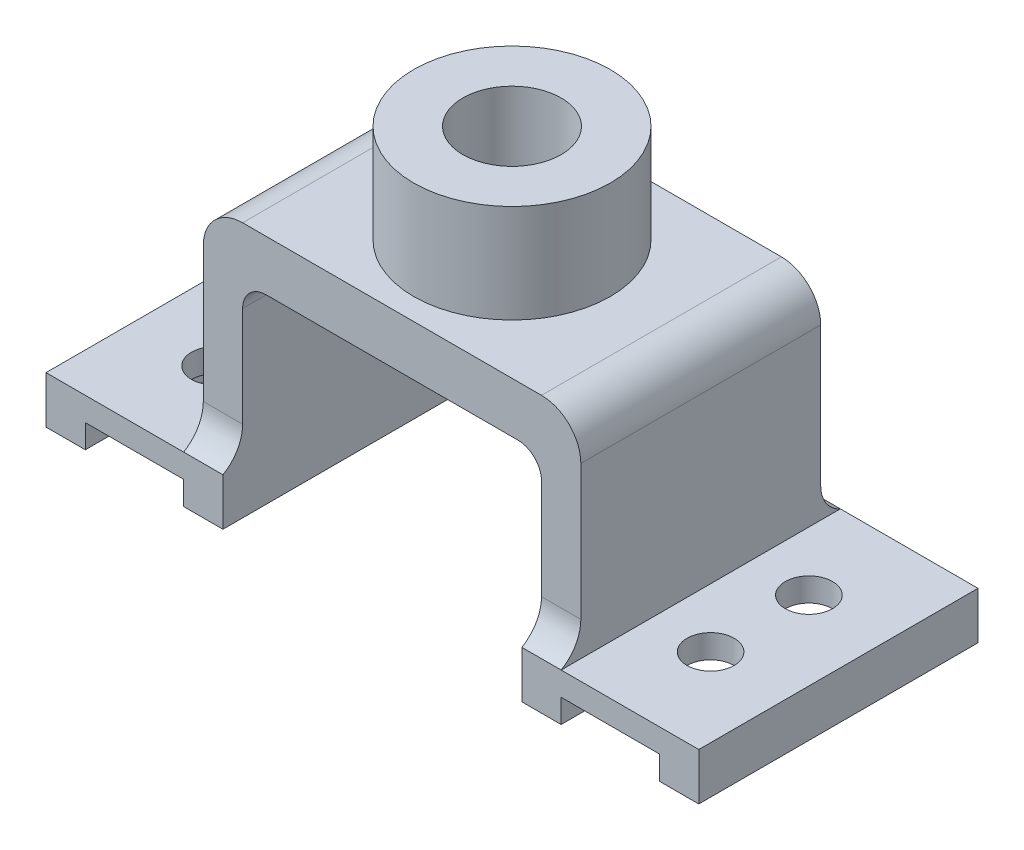
ISO-10303-21;
HEADER;
FILE_DESCRIPTION(('STEP AP214'),'2;1');
FILE_NAME('part.step','',(''),(''),'','','');
FILE_SCHEMA(('AUTOMOTIVE_DESIGN { 1 0 10303 214 1 1 1 1 }'));
ENDSEC;
DATA;
#1=APPLICATION_CONTEXT('core data for automotive mechanical design processes');
#2=APPLICATION_PROTOCOL_DEFINITION('international standard','automotive_design',2000,#1);
#3=PRODUCT_CONTEXT('',#1,'mechanical');
#4=PRODUCT('Part','Part','',(#3));
#5=PRODUCT_RELATED_PRODUCT_CATEGORY('part','',(#4));
#6=PRODUCT_DEFINITION_FORMATION('','',#4);
#7=PRODUCT_DEFINITION_CONTEXT('part definition',#1,'design');
#8=PRODUCT_DEFINITION('design','',#6,#7);
#9=PRODUCT_DEFINITION_SHAPE('','',#8);
#10=(LENGTH_UNIT() NAMED_UNIT(*) SI_UNIT(.MILLI.,.METRE.));
#11=(NAMED_UNIT(*) PLANE_ANGLE_UNIT() SI_UNIT($,.RADIAN.));
#12=(NAMED_UNIT(*) SI_UNIT($,.STERADIAN.) SOLID_ANGLE_UNIT());
#13=UNCERTAINTY_MEASURE_WITH_UNIT(LENGTH_MEASURE(1.E-05),#10,'distance_accuracy_value','');
#14=(GEOMETRIC_REPRESENTATION_CONTEXT(3) GLOBAL_UNCERTAINTY_ASSIGNED_CONTEXT((#13)) GLOBAL_UNIT_ASSIGNED_CONTEXT((#10,
#11,#12)) REPRESENTATION_CONTEXT('',''));
#15=CARTESIAN_POINT('',(0.,0.,0.));
#16=DIRECTION('',(0.,0.,1.));
#17=DIRECTION('',(1.,0.,0.));
#18=AXIS2_PLACEMENT_3D('',#15,#16,#17);
#19=CARTESIAN_POINT('',(0.,65.,0.));
#20=DIRECTION('',(0.,1.,0.));
#21=DIRECTION('',(0.,0.,1.));
#22=AXIS2_PLACEMENT_3D('',#19,#20,#21);
#23=PLANE('',#22);
#24=DIRECTION('',(-1.,0.,0.));
#25=VECTOR('',#24,1.);
#26=CARTESIAN_POINT('',(166.000025,65.,-5.));
#27=LINE('',#26,#25);
#28=CARTESIAN_POINT('',(121.,65.,-5.));
#29=VERTEX_POINT('',#28);
#30=CARTESIAN_POINT('',(45.,65.,-5.));
#31=VERTEX_POINT('',#30);
#32=EDGE_CURVE('E445',#29,#31,#27,.T.);
#33=ORIENTED_EDGE('',*,*,#32,.F.);
#34=DIRECTION('',(0.,0.,-1.));
#35=VECTOR('',#34,1.);
#36=CARTESIAN_POINT('',(121.,65.,0.));
#37=LINE('',#36,#35);
#38=CARTESIAN_POINT('',(121.,65.,-66.));
#39=VERTEX_POINT('',#38);
#40=EDGE_CURVE('E676',#29,#39,#37,.T.);
#41=ORIENTED_EDGE('',*,*,#40,.T.);
#42=DIRECTION('',(-1.,0.,0.));
#43=VECTOR('',#42,1.);
#44=CARTESIAN_POINT('',(166.000025,65.,-66.));
#45=LINE('',#44,#43);
#46=CARTESIAN_POINT('',(45.,65.,-66.));
#47=VERTEX_POINT('',#46);
#48=EDGE_CURVE('E464',#39,#47,#45,.T.);
#49=ORIENTED_EDGE('',*,*,#48,.T.);
#50=DIRECTION('',(0.,0.,1.));
#51=VECTOR('',#50,1.);
#52=CARTESIAN_POINT('',(45.,65.,0.));
#53=LINE('',#52,#51);
#54=EDGE_CURVE('E342',#47,#31,#53,.T.);
#55=ORIENTED_EDGE('',*,*,#54,.T.);
#56=EDGE_LOOP('',(#33,#41,#49,#55));
#57=FACE_BOUND('',#56,.T.);
#58=CARTESIAN_POINT('',(83.,65.,-35.5));
#59=DIRECTION('',(0.,1.,0.));
#60=DIRECTION('',(0.,0.,1.));
#61=AXIS2_PLACEMENT_3D('',#58,#59,#60);
#62=CIRCLE('',#61,25.);
#63=CARTESIAN_POINT('',(83.,65.,-10.5));
#64=VERTEX_POINT('',#63);
#65=EDGE_CURVE('E1028',#64,#64,#62,.T.);
#66=ORIENTED_EDGE('',*,*,#65,.F.);
#67=EDGE_LOOP('',(#66));
#68=FACE_BOUND('',#67,.T.);
#69=ADVANCED_FACE('F33',(#57,#68),#23,.T.);
#70=CARTESIAN_POINT('',(121.,55.,0.));
#71=DIRECTION('',(0.,0.,1.));
#72=DIRECTION('',(1.,0.,0.));
#73=AXIS2_PLACEMENT_3D('',#70,#71,#72);
#74=CYLINDRICAL_SURFACE('',#73,10.);
#75=ORIENTED_EDGE('',*,*,#40,.F.);
#76=CARTESIAN_POINT('',(121.,55.,-5.));
#77=DIRECTION('',(0.,0.,-1.));
#78=DIRECTION('',(0.,1.,0.));
#79=AXIS2_PLACEMENT_3D('',#76,#77,#78);
#80=CIRCLE('',#79,10.);
#81=CARTESIAN_POINT('',(131.,55.,-5.));
#82=VERTEX_POINT('',#81);
#83=EDGE_CURVE('E42',#82,#29,#80,.F.);
#84=ORIENTED_EDGE('',*,*,#83,.F.);
#85=DIRECTION('',(0.,0.,-1.));
#86=VECTOR('',#85,1.);
#87=CARTESIAN_POINT('',(131.,55.,0.));
#88=LINE('',#87,#86);
#89=CARTESIAN_POINT('',(131.,55.,-66.));
#90=VERTEX_POINT('',#89);
#91=EDGE_CURVE('E686',#90,#82,#88,.F.);
#92=ORIENTED_EDGE('',*,*,#91,.F.);
#93=CARTESIAN_POINT('',(121.,55.,-66.));
#94=DIRECTION('',(0.,0.,1.));
#95=DIRECTION('',(1.,0.,0.));
#96=AXIS2_PLACEMENT_3D('',#93,#94,#95);
#97=CIRCLE('',#96,10.);
#98=EDGE_CURVE('E11',#39,#90,#97,.F.);
#99=ORIENTED_EDGE('',*,*,#98,.F.);
#100=EDGE_LOOP('',(#75,#84,#92,#99));
#101=FACE_BOUND('',#100,.T.);
#102=ADVANCED_FACE('F35',(#101),#74,.T.);
#103=CARTESIAN_POINT('',(45.,55.,0.));
#104=DIRECTION('',(0.,0.,-1.));
#105=DIRECTION('',(-1.,0.,0.));
#106=AXIS2_PLACEMENT_3D('',#103,#104,#105);
#107=CYLINDRICAL_SURFACE('',#106,10.);
#108=ORIENTED_EDGE('',*,*,#54,.F.);
#109=CARTESIAN_POINT('',(45.,55.,-66.));
#110=DIRECTION('',(0.,0.,1.));
#111=DIRECTION('',(1.,0.,0.));
#112=AXIS2_PLACEMENT_3D('',#109,#110,#111);
#113=CIRCLE('',#112,10.);
#114=CARTESIAN_POINT('',(35.,55.,-66.));
#115=VERTEX_POINT('',#114);
#116=EDGE_CURVE('E677',#115,#47,#113,.F.);
#117=ORIENTED_EDGE('',*,*,#116,.F.);
#118=DIRECTION('',(0.,0.,1.));
#119=VECTOR('',#118,1.);
#120=CARTESIAN_POINT('',(35.,55.,0.));
#121=LINE('',#120,#119);
#122=CARTESIAN_POINT('',(35.,55.,-5.));
#123=VERTEX_POINT('',#122);
#124=EDGE_CURVE('E679',#123,#115,#121,.F.);
#125=ORIENTED_EDGE('',*,*,#124,.F.);
#126=CARTESIAN_POINT('',(45.,55.,-5.));
#127=DIRECTION('',(0.,0.,-1.));
#128=DIRECTION('',(0.,1.,0.));
#129=AXIS2_PLACEMENT_3D('',#126,#127,#128);
#130=CIRCLE('',#129,10.);
#131=EDGE_CURVE('E671',#31,#123,#130,.F.);
#132=ORIENTED_EDGE('',*,*,#131,.F.);
#133=EDGE_LOOP('',(#108,#117,#125,#132));
#134=FACE_BOUND('',#133,.T.);
#135=ADVANCED_FACE('F397',(#134),#107,.T.);
#136=CARTESIAN_POINT('',(0.,12.,0.));
#137=DIRECTION('',(0.,-1.,0.));
#138=DIRECTION('',(0.,0.,-1.));
#139=AXIS2_PLACEMENT_3D('',#136,#137,#138);
#140=PLANE('',#139);
#141=CARTESIAN_POINT('',(146.,12.,-23.));
#142=DIRECTION('',(0.,1.,0.));
#143=DIRECTION('',(0.,0.,1.));
#144=AXIS2_PLACEMENT_3D('',#141,#142,#143);
#145=CIRCLE('',#144,6.00000000000002);
#146=CARTESIAN_POINT('',(146.,12.,-17.));
#147=VERTEX_POINT('',#146);
#148=EDGE_CURVE('E344',#147,#147,#145,.T.);
#149=ORIENTED_EDGE('',*,*,#148,.F.);
#150=EDGE_LOOP('',(#149));
#151=FACE_BOUND('',#150,.T.);
#152=CARTESIAN_POINT('',(146.,12.,-48.));
#153=DIRECTION('',(0.,1.,0.));
#154=DIRECTION('',(0.,0.,1.));
#155=AXIS2_PLACEMENT_3D('',#152,#153,#154);
#156=CIRCLE('',#155,6.00000000000002);
#157=CARTESIAN_POINT('',(146.,12.,-42.));
#158=VERTEX_POINT('',#157);
#159=EDGE_CURVE('E386',#158,#158,#156,.T.);
#160=ORIENTED_EDGE('',*,*,#159,.F.);
#161=EDGE_LOOP('',(#160));
#162=FACE_BOUND('',#161,.T.);
#163=DIRECTION('',(-1.,0.,0.));
#164=VECTOR('',#163,1.);
#165=CARTESIAN_POINT('',(0.,12.,-71.));
#166=LINE('',#165,#164);
#167=CARTESIAN_POINT('',(166.,12.,-71.));
#168=VERTEX_POINT('',#167);
#169=CARTESIAN_POINT('',(131.,12.,-71.));
#170=VERTEX_POINT('',#169);
#171=EDGE_CURVE('E363',#168,#170,#166,.T.);
#172=ORIENTED_EDGE('',*,*,#171,.T.);
#173=DIRECTION('',(0.,0.,-1.));
#174=VECTOR('',#173,1.);
#175=CARTESIAN_POINT('',(131.,12.,-71.));
#176=LINE('',#175,#174);
#177=CARTESIAN_POINT('',(131.,12.,0.));
#178=VERTEX_POINT('',#177);
#179=EDGE_CURVE('E244',#178,#170,#176,.T.);
#180=ORIENTED_EDGE('',*,*,#179,.F.);
#181=DIRECTION('',(1.,0.,0.));
#182=VECTOR('',#181,1.);
#183=CARTESIAN_POINT('',(0.,12.,0.));
#184=LINE('',#183,#182);
#185=CARTESIAN_POINT('',(166.,12.,0.));
#186=VERTEX_POINT('',#185);
#187=EDGE_CURVE('E350',#178,#186,#184,.T.);
#188=ORIENTED_EDGE('',*,*,#187,.T.);
#189=DIRECTION('',(0.,0.,-1.));
#190=VECTOR('',#189,1.);
#191=CARTESIAN_POINT('',(166.,12.,0.));
#192=LINE('',#191,#190);
#193=EDGE_CURVE('E349',#186,#168,#192,.T.);
#194=ORIENTED_EDGE('',*,*,#193,.T.);
#195=EDGE_LOOP('',(#172,#180,#188,#194));
#196=FACE_BOUND('',#195,.T.);
#197=ADVANCED_FACE('F393',(#151,#162,#196),#140,.F.);
#198=CARTESIAN_POINT('',(166.000025,65.,-5.));
#199=DIRECTION('',(0.,0.,-1.));
#200=DIRECTION('',(0.,1.,0.));
#201=AXIS2_PLACEMENT_3D('',#198,#199,#200);
#202=PLANE('',#201);
#203=DIRECTION('',(0.,-1.,0.));
#204=VECTOR('',#203,1.);
#205=CARTESIAN_POINT('',(131.,65.,-5.));
#206=LINE('',#205,#204);
#207=CARTESIAN_POINT('',(131.,20.6602540378444,-5.));
#208=VERTEX_POINT('',#207);
#209=EDGE_CURVE('E459',#82,#208,#206,.T.);
#210=ORIENTED_EDGE('',*,*,#209,.F.);
#211=ORIENTED_EDGE('',*,*,#83,.T.);
#212=ORIENTED_EDGE('',*,*,#32,.T.);
#213=ORIENTED_EDGE('',*,*,#131,.T.);
#214=DIRECTION('',(0.,-1.,0.));
#215=VECTOR('',#214,1.);
#216=CARTESIAN_POINT('',(35.,65.,-5.));
#217=LINE('',#216,#215);
#218=CARTESIAN_POINT('',(35.,20.6602540378444,-5.));
#219=VERTEX_POINT('',#218);
#220=EDGE_CURVE('E438',#123,#219,#217,.T.);
#221=ORIENTED_EDGE('',*,*,#220,.T.);
#222=DIRECTION('',(-1.,0.,0.));
#223=VECTOR('',#222,1.);
#224=CARTESIAN_POINT('',(55.,20.6602540378444,-5.));
#225=LINE('',#224,#223);
#226=CARTESIAN_POINT('',(45.,20.6602540378444,-5.));
#227=VERTEX_POINT('',#226);
#228=EDGE_CURVE('E430',#227,#219,#225,.T.);
#229=ORIENTED_EDGE('',*,*,#228,.F.);
#230=DIRECTION('',(0.,-1.,0.));
#231=VECTOR('',#230,1.);
#232=CARTESIAN_POINT('',(45.,0.,-4.99999999999999));
#233=LINE('',#232,#231);
#234=CARTESIAN_POINT('',(45.,46.1355405561037,-5.));
#235=VERTEX_POINT('',#234);
#236=EDGE_CURVE('E456',#235,#227,#233,.T.);
#237=ORIENTED_EDGE('',*,*,#236,.F.);
#238=CARTESIAN_POINT('',(51.,46.1355405561037,-5.));
#239=DIRECTION('',(0.,0.,-1.));
#240=DIRECTION('',(0.,1.,0.));
#241=AXIS2_PLACEMENT_3D('',#238,#239,#240);
#242=CIRCLE('',#241,6.);
#243=CARTESIAN_POINT('',(51.0000000000001,52.1355405561037,-5.));
#244=VERTEX_POINT('',#243);
#245=EDGE_CURVE('E453',#244,#235,#242,.F.);
#246=ORIENTED_EDGE('',*,*,#245,.F.);
#247=DIRECTION('',(-1.,0.,0.));
#248=VECTOR('',#247,1.);
#249=CARTESIAN_POINT('',(51.0000000000001,52.1355405561037,-5.));
#250=LINE('',#249,#248);
#251=CARTESIAN_POINT('',(115.,52.1355405561037,-5.00000000000001));
#252=VERTEX_POINT('',#251);
#253=EDGE_CURVE('E450',#252,#244,#250,.T.);
#254=ORIENTED_EDGE('',*,*,#253,.F.);
#255=CARTESIAN_POINT('',(115.,46.1355405561037,-5.));
#256=DIRECTION('',(0.,0.,-1.));
#257=DIRECTION('',(0.,1.,0.));
#258=AXIS2_PLACEMENT_3D('',#255,#256,#257);
#259=CIRCLE('',#258,6.);
#260=CARTESIAN_POINT('',(121.,46.1355405561037,-5.));
#261=VERTEX_POINT('',#260);
#262=EDGE_CURVE('E447',#261,#252,#259,.F.);
#263=ORIENTED_EDGE('',*,*,#262,.F.);
#264=DIRECTION('',(0.,1.,0.));
#265=VECTOR('',#264,1.);
#266=CARTESIAN_POINT('',(121.,0.,-4.99999999999999));
#267=LINE('',#266,#265);
#268=CARTESIAN_POINT('',(121.,20.6602540378444,-4.99999999999999));
#269=VERTEX_POINT('',#268);
#270=EDGE_CURVE('E340',#269,#261,#267,.T.);
#271=ORIENTED_EDGE('',*,*,#270,.F.);
#272=DIRECTION('',(1.,0.,0.));
#273=VECTOR('',#272,1.);
#274=CARTESIAN_POINT('',(111.,20.6602540378444,-5.));
#275=LINE('',#274,#273);
#276=EDGE_CURVE('E420',#269,#208,#275,.T.);
#277=ORIENTED_EDGE('',*,*,#276,.T.);
#278=EDGE_LOOP('',(#210,#211,#212,#213,#221,#229,#237,#246,#254,#263,#271,#277));
#279=FACE_BOUND('',#278,.T.);
#280=ADVANCED_FACE('F396',(#279),#202,.F.);
#281=CARTESIAN_POINT('',(20.,12.,-23.));
#282=DIRECTION('',(0.,1.,0.));
#283=DIRECTION('',(0.,0.,1.));
#284=AXIS2_PLACEMENT_3D('',#281,#282,#283);
#285=CIRCLE('',#284,5.99999999999999);
#286=CARTESIAN_POINT('',(20.,12.,-17.));
#287=VERTEX_POINT('',#286);
#288=EDGE_CURVE('E383',#287,#287,#285,.T.);
#289=ORIENTED_EDGE('',*,*,#288,.F.);
#290=EDGE_LOOP('',(#289));
#291=FACE_BOUND('',#290,.T.);
#292=CARTESIAN_POINT('',(20.,12.,-48.));
#293=DIRECTION('',(0.,1.,0.));
#294=DIRECTION('',(0.,0.,1.));
#295=AXIS2_PLACEMENT_3D('',#292,#293,#294);
#296=CIRCLE('',#295,6.);
#297=CARTESIAN_POINT('',(20.,12.,-42.));
#298=VERTEX_POINT('',#297);
#299=EDGE_CURVE('E380',#298,#298,#296,.T.);
#300=ORIENTED_EDGE('',*,*,#299,.F.);
#301=EDGE_LOOP('',(#300));
#302=FACE_BOUND('',#301,.T.);
#303=CARTESIAN_POINT('',(0.,12.,0.));
#304=VERTEX_POINT('',#303);
#305=CARTESIAN_POINT('',(35.,12.,0.));
#306=VERTEX_POINT('',#305);
#307=EDGE_CURVE('E370',#304,#306,#184,.T.);
#308=ORIENTED_EDGE('',*,*,#307,.T.);
#309=DIRECTION('',(0.,0.,1.));
#310=VECTOR('',#309,1.);
#311=CARTESIAN_POINT('',(35.,12.,-71.));
#312=LINE('',#311,#310);
#313=CARTESIAN_POINT('',(35.,12.,-71.));
#314=VERTEX_POINT('',#313);
#315=EDGE_CURVE('E330',#314,#306,#312,.T.);
#316=ORIENTED_EDGE('',*,*,#315,.F.);
#317=CARTESIAN_POINT('',(0.,12.,-71.));
#318=VERTEX_POINT('',#317);
#319=EDGE_CURVE('E345',#314,#318,#166,.T.);
#320=ORIENTED_EDGE('',*,*,#319,.T.);
#321=DIRECTION('',(0.,0.,1.));
#322=VECTOR('',#321,1.);
#323=CARTESIAN_POINT('',(0.,12.,0.));
#324=LINE('',#323,#322);
#325=EDGE_CURVE('E374',#318,#304,#324,.T.);
#326=ORIENTED_EDGE('',*,*,#325,.T.);
#327=EDGE_LOOP('',(#308,#316,#320,#326));
#328=FACE_BOUND('',#327,.T.);
#329=ADVANCED_FACE('F399',(#291,#302,#328),#140,.F.);
#330=CARTESIAN_POINT('',(166.000025,65.,-66.));
#331=DIRECTION('',(0.,0.,1.));
#332=DIRECTION('',(1.,0.,0.));
#333=AXIS2_PLACEMENT_3D('',#330,#331,#332);
#334=PLANE('',#333);
#335=ORIENTED_EDGE('',*,*,#48,.F.);
#336=ORIENTED_EDGE('',*,*,#98,.T.);
#337=DIRECTION('',(0.,1.,0.));
#338=VECTOR('',#337,1.);
#339=CARTESIAN_POINT('',(131.,65.,-66.));
#340=LINE('',#339,#338);
#341=CARTESIAN_POINT('',(131.,19.6101485876254,-66.));
#342=VERTEX_POINT('',#341);
#343=EDGE_CURVE('E242',#342,#90,#340,.T.);
#344=ORIENTED_EDGE('',*,*,#343,.F.);
#345=DIRECTION('',(1.,0.,0.));
#346=VECTOR('',#345,1.);
#347=CARTESIAN_POINT('',(111.,19.6101485876254,-66.));
#348=LINE('',#347,#346);
#349=CARTESIAN_POINT('',(121.,19.6101485876254,-66.));
#350=VERTEX_POINT('',#349);
#351=EDGE_CURVE('E229',#350,#342,#348,.T.);
#352=ORIENTED_EDGE('',*,*,#351,.F.);
#353=DIRECTION('',(0.,-1.,0.));
#354=VECTOR('',#353,1.);
#355=CARTESIAN_POINT('',(121.,0.,-66.));
#356=LINE('',#355,#354);
#357=CARTESIAN_POINT('',(121.,46.1355405561037,-66.));
#358=VERTEX_POINT('',#357);
#359=EDGE_CURVE('E338',#358,#350,#356,.T.);
#360=ORIENTED_EDGE('',*,*,#359,.F.);
#361=CARTESIAN_POINT('',(115.,46.1355405561037,-66.));
#362=DIRECTION('',(0.,0.,1.));
#363=DIRECTION('',(1.,0.,0.));
#364=AXIS2_PLACEMENT_3D('',#361,#362,#363);
#365=CIRCLE('',#364,6.);
#366=CARTESIAN_POINT('',(115.,52.1355405561037,-66.));
#367=VERTEX_POINT('',#366);
#368=EDGE_CURVE('E466',#367,#358,#365,.F.);
#369=ORIENTED_EDGE('',*,*,#368,.F.);
#370=DIRECTION('',(1.,0.,0.));
#371=VECTOR('',#370,1.);
#372=CARTESIAN_POINT('',(51.0000000000001,52.1355405561037,-66.));
#373=LINE('',#372,#371);
#374=CARTESIAN_POINT('',(51.0000000000001,52.1355405561037,-66.));
#375=VERTEX_POINT('',#374);
#376=EDGE_CURVE('E469',#375,#367,#373,.T.);
#377=ORIENTED_EDGE('',*,*,#376,.F.);
#378=CARTESIAN_POINT('',(51.,46.1355405561037,-66.));
#379=DIRECTION('',(0.,0.,1.));
#380=DIRECTION('',(1.,0.,0.));
#381=AXIS2_PLACEMENT_3D('',#378,#379,#380);
#382=CIRCLE('',#381,6.);
#383=CARTESIAN_POINT('',(45.,46.1355405561037,-66.));
#384=VERTEX_POINT('',#383);
#385=EDGE_CURVE('E253',#384,#375,#382,.F.);
#386=ORIENTED_EDGE('',*,*,#385,.F.);
#387=DIRECTION('',(0.,1.,0.));
#388=VECTOR('',#387,1.);
#389=CARTESIAN_POINT('',(45.,0.,-66.));
#390=LINE('',#389,#388);
#391=CARTESIAN_POINT('',(45.,19.6101485876254,-66.));
#392=VERTEX_POINT('',#391);
#393=EDGE_CURVE('E249',#392,#384,#390,.T.);
#394=ORIENTED_EDGE('',*,*,#393,.F.);
#395=DIRECTION('',(-1.,0.,0.));
#396=VECTOR('',#395,1.);
#397=CARTESIAN_POINT('',(55.,19.6101485876254,-66.));
#398=LINE('',#397,#396);
#399=CARTESIAN_POINT('',(35.,19.6101485876254,-66.));
#400=VERTEX_POINT('',#399);
#401=EDGE_CURVE('E439',#392,#400,#398,.T.);
#402=ORIENTED_EDGE('',*,*,#401,.T.);
#403=DIRECTION('',(0.,1.,0.));
#404=VECTOR('',#403,1.);
#405=CARTESIAN_POINT('',(35.,65.,-66.));
#406=LINE('',#405,#404);
#407=EDGE_CURVE('E461',#400,#115,#406,.T.);
#408=ORIENTED_EDGE('',*,*,#407,.T.);
#409=ORIENTED_EDGE('',*,*,#116,.T.);
#410=EDGE_LOOP('',(#335,#336,#344,#352,#360,#369,#377,#386,#394,#402,#408,#409));
#411=FACE_BOUND('',#410,.T.);
#412=ADVANCED_FACE('F247',(#411),#334,.F.);
#413=CARTESIAN_POINT('',(0.,12.,0.));
#414=DIRECTION('',(0.,0.,-1.));
#415=DIRECTION('',(-1.,0.,0.));
#416=AXIS2_PLACEMENT_3D('',#413,#414,#415);
#417=PLANE('',#416);
#418=CARTESIAN_POINT('',(121.,12.,0.));
#419=VERTEX_POINT('',#418);
#420=EDGE_CURVE('E367',#419,#178,#184,.T.);
#421=ORIENTED_EDGE('',*,*,#420,.F.);
#422=DIRECTION('',(0.,1.,0.));
#423=VECTOR('',#422,1.);
#424=CARTESIAN_POINT('',(121.,0.,0.));
#425=LINE('',#424,#423);
#426=CARTESIAN_POINT('',(121.,0.,0.));
#427=VERTEX_POINT('',#426);
#428=EDGE_CURVE('E310',#427,#419,#425,.T.);
#429=ORIENTED_EDGE('',*,*,#428,.F.);
#430=DIRECTION('',(1.,0.,0.));
#431=VECTOR('',#430,1.);
#432=CARTESIAN_POINT('',(0.,0.,0.));
#433=LINE('',#432,#431);
#434=CARTESIAN_POINT('',(131.,0.,0.));
#435=VERTEX_POINT('',#434);
#436=EDGE_CURVE('E556',#427,#435,#433,.T.);
#437=ORIENTED_EDGE('',*,*,#436,.T.);
#438=DIRECTION('',(0.,-1.,0.));
#439=VECTOR('',#438,1.);
#440=CARTESIAN_POINT('',(131.,0.,0.));
#441=LINE('',#440,#439);
#442=CARTESIAN_POINT('',(131.,6.,0.));
#443=VERTEX_POINT('',#442);
#444=EDGE_CURVE('E248',#443,#435,#441,.T.);
#445=ORIENTED_EDGE('',*,*,#444,.F.);
#446=DIRECTION('',(-1.,0.,0.));
#447=VECTOR('',#446,1.);
#448=CARTESIAN_POINT('',(131.,6.,0.));
#449=LINE('',#448,#447);
#450=CARTESIAN_POINT('',(156.,6.,0.));
#451=VERTEX_POINT('',#450);
#452=EDGE_CURVE('E259',#451,#443,#449,.T.);
#453=ORIENTED_EDGE('',*,*,#452,.F.);
#454=DIRECTION('',(0.,1.,0.));
#455=VECTOR('',#454,1.);
#456=CARTESIAN_POINT('',(156.,0.,0.));
#457=LINE('',#456,#455);
#458=CARTESIAN_POINT('',(156.,0.,0.));
#459=VERTEX_POINT('',#458);
#460=EDGE_CURVE('E251',#459,#451,#457,.T.);
#461=ORIENTED_EDGE('',*,*,#460,.F.);
#462=CARTESIAN_POINT('',(166.,0.,0.));
#463=VERTEX_POINT('',#462);
#464=EDGE_CURVE('E503',#459,#463,#433,.T.);
#465=ORIENTED_EDGE('',*,*,#464,.T.);
#466=DIRECTION('',(0.,-1.,0.));
#467=VECTOR('',#466,1.);
#468=CARTESIAN_POINT('',(166.,12.,0.));
#469=LINE('',#468,#467);
#470=EDGE_CURVE('E500',#186,#463,#469,.T.);
#471=ORIENTED_EDGE('',*,*,#470,.F.);
#472=ORIENTED_EDGE('',*,*,#187,.F.);
#473=EDGE_LOOP('',(#421,#429,#437,#445,#453,#461,#465,#471,#472));
#474=FACE_BOUND('',#473,.T.);
#475=ADVANCED_FACE('F497',(#474),#417,.F.);
#476=CARTESIAN_POINT('',(0.,12.,-71.));
#477=DIRECTION('',(0.,0.,1.));
#478=DIRECTION('',(1.,0.,0.));
#479=AXIS2_PLACEMENT_3D('',#476,#477,#478);
#480=PLANE('',#479);
#481=CARTESIAN_POINT('',(45.,12.,-71.));
#482=VERTEX_POINT('',#481);
#483=EDGE_CURVE('E348',#482,#314,#166,.T.);
#484=ORIENTED_EDGE('',*,*,#483,.F.);
#485=DIRECTION('',(0.,-1.,0.));
#486=VECTOR('',#485,1.);
#487=CARTESIAN_POINT('',(45.,12.,-71.));
#488=LINE('',#487,#486);
#489=CARTESIAN_POINT('',(45.,0.,-71.));
#490=VERTEX_POINT('',#489);
#491=EDGE_CURVE('E328',#482,#490,#488,.T.);
#492=ORIENTED_EDGE('',*,*,#491,.T.);
#493=DIRECTION('',(-1.,0.,0.));
#494=VECTOR('',#493,1.);
#495=CARTESIAN_POINT('',(0.,0.,-71.));
#496=LINE('',#495,#494);
#497=CARTESIAN_POINT('',(35.,0.,-71.));
#498=VERTEX_POINT('',#497);
#499=EDGE_CURVE('E552',#490,#498,#496,.T.);
#500=ORIENTED_EDGE('',*,*,#499,.T.);
#501=DIRECTION('',(0.,1.,0.));
#502=VECTOR('',#501,1.);
#503=CARTESIAN_POINT('',(35.,12.,-71.));
#504=LINE('',#503,#502);
#505=CARTESIAN_POINT('',(35.,6.,-71.));
#506=VERTEX_POINT('',#505);
#507=EDGE_CURVE('E692',#498,#506,#504,.T.);
#508=ORIENTED_EDGE('',*,*,#507,.T.);
#509=DIRECTION('',(-1.,0.,0.));
#510=VECTOR('',#509,1.);
#511=CARTESIAN_POINT('',(0.,6.,-71.));
#512=LINE('',#511,#510);
#513=CARTESIAN_POINT('',(10.,6.,-71.));
#514=VERTEX_POINT('',#513);
#515=EDGE_CURVE('E305',#506,#514,#512,.T.);
#516=ORIENTED_EDGE('',*,*,#515,.T.);
#517=DIRECTION('',(0.,-1.,0.));
#518=VECTOR('',#517,1.);
#519=CARTESIAN_POINT('',(10.,12.,-71.));
#520=LINE('',#519,#518);
#521=CARTESIAN_POINT('',(10.,0.,-71.));
#522=VERTEX_POINT('',#521);
#523=EDGE_CURVE('E700',#514,#522,#520,.T.);
#524=ORIENTED_EDGE('',*,*,#523,.T.);
#525=CARTESIAN_POINT('',(0.,0.,-71.));
#526=VERTEX_POINT('',#525);
#527=EDGE_CURVE('E541',#522,#526,#496,.T.);
#528=ORIENTED_EDGE('',*,*,#527,.T.);
#529=DIRECTION('',(0.,-1.,0.));
#530=VECTOR('',#529,1.);
#531=CARTESIAN_POINT('',(0.,12.,-71.));
#532=LINE('',#531,#530);
#533=EDGE_CURVE('E366',#318,#526,#532,.T.);
#534=ORIENTED_EDGE('',*,*,#533,.F.);
#535=ORIENTED_EDGE('',*,*,#319,.F.);
#536=EDGE_LOOP('',(#484,#492,#500,#508,#516,#524,#528,#534,#535));
#537=FACE_BOUND('',#536,.T.);
#538=ADVANCED_FACE('F536',(#537),#480,.F.);
#539=CARTESIAN_POINT('',(0.,0.,0.));
#540=DIRECTION('',(0.,-1.,0.));
#541=DIRECTION('',(0.,0.,-1.));
#542=AXIS2_PLACEMENT_3D('',#539,#540,#541);
#543=PLANE('',#542);
#544=DIRECTION('',(0.,0.,1.));
#545=VECTOR('',#544,1.);
#546=CARTESIAN_POINT('',(131.,0.,-71.00005));
#547=LINE('',#546,#545);
#548=CARTESIAN_POINT('',(131.,0.,-71.));
#549=VERTEX_POINT('',#548);
#550=EDGE_CURVE('E262',#549,#435,#547,.T.);
#551=ORIENTED_EDGE('',*,*,#550,.T.);
#552=ORIENTED_EDGE('',*,*,#436,.F.);
#553=DIRECTION('',(0.,0.,1.));
#554=VECTOR('',#553,1.);
#555=CARTESIAN_POINT('',(121.,0.,0.));
#556=LINE('',#555,#554);
#557=CARTESIAN_POINT('',(121.,0.,-71.));
#558=VERTEX_POINT('',#557);
#559=EDGE_CURVE('E546',#558,#427,#556,.T.);
#560=ORIENTED_EDGE('',*,*,#559,.F.);
#561=EDGE_CURVE('E551',#549,#558,#496,.T.);
#562=ORIENTED_EDGE('',*,*,#561,.F.);
#563=EDGE_LOOP('',(#551,#552,#560,#562));
#564=FACE_BOUND('',#563,.T.);
#565=ADVANCED_FACE('F564',(#564),#543,.T.);
#566=DIRECTION('',(0.,0.,1.));
#567=VECTOR('',#566,1.);
#568=CARTESIAN_POINT('',(10.,0.,-71.00005));
#569=LINE('',#568,#567);
#570=CARTESIAN_POINT('',(10.,0.,0.));
#571=VERTEX_POINT('',#570);
#572=EDGE_CURVE('E292',#522,#571,#569,.T.);
#573=ORIENTED_EDGE('',*,*,#572,.T.);
#574=CARTESIAN_POINT('',(0.,0.,0.));
#575=VERTEX_POINT('',#574);
#576=EDGE_CURVE('E554',#575,#571,#433,.T.);
#577=ORIENTED_EDGE('',*,*,#576,.F.);
#578=DIRECTION('',(0.,0.,1.));
#579=VECTOR('',#578,1.);
#580=CARTESIAN_POINT('',(0.,0.,0.));
#581=LINE('',#580,#579);
#582=EDGE_CURVE('E356',#526,#575,#581,.T.);
#583=ORIENTED_EDGE('',*,*,#582,.F.);
#584=ORIENTED_EDGE('',*,*,#527,.F.);
#585=EDGE_LOOP('',(#573,#577,#583,#584));
#586=FACE_BOUND('',#585,.T.);
#587=ADVANCED_FACE('F590',(#586),#543,.T.);
#588=DIRECTION('',(0.,0.,1.));
#589=VECTOR('',#588,1.);
#590=CARTESIAN_POINT('',(35.,0.,-71.00005));
#591=LINE('',#590,#589);
#592=CARTESIAN_POINT('',(35.,0.,0.));
#593=VERTEX_POINT('',#592);
#594=EDGE_CURVE('E298',#498,#593,#591,.T.);
#595=ORIENTED_EDGE('',*,*,#594,.F.);
#596=ORIENTED_EDGE('',*,*,#499,.F.);
#597=DIRECTION('',(0.,0.,-1.));
#598=VECTOR('',#597,1.);
#599=CARTESIAN_POINT('',(45.,0.,0.));
#600=LINE('',#599,#598);
#601=CARTESIAN_POINT('',(45.,0.,0.));
#602=VERTEX_POINT('',#601);
#603=EDGE_CURVE('E547',#602,#490,#600,.T.);
#604=ORIENTED_EDGE('',*,*,#603,.F.);
#605=EDGE_CURVE('E555',#593,#602,#433,.T.);
#606=ORIENTED_EDGE('',*,*,#605,.F.);
#607=EDGE_LOOP('',(#595,#596,#604,#606));
#608=FACE_BOUND('',#607,.T.);
#609=ADVANCED_FACE('F580',(#608),#543,.T.);
#610=CARTESIAN_POINT('',(0.,12.,0.));
#611=DIRECTION('',(1.,0.,0.));
#612=DIRECTION('',(0.,0.,-1.));
#613=AXIS2_PLACEMENT_3D('',#610,#611,#612);
#614=PLANE('',#613);
#615=ORIENTED_EDGE('',*,*,#582,.T.);
#616=DIRECTION('',(0.,-1.,0.));
#617=VECTOR('',#616,1.);
#618=CARTESIAN_POINT('',(0.,12.,0.));
#619=LINE('',#618,#617);
#620=EDGE_CURVE('E506',#304,#575,#619,.T.);
#621=ORIENTED_EDGE('',*,*,#620,.F.);
#622=ORIENTED_EDGE('',*,*,#325,.F.);
#623=ORIENTED_EDGE('',*,*,#533,.T.);
#624=EDGE_LOOP('',(#615,#621,#622,#623));
#625=FACE_BOUND('',#624,.T.);
#626=ADVANCED_FACE('F545',(#625),#614,.F.);
#627=DIRECTION('',(0.,-1.,0.));
#628=VECTOR('',#627,1.);
#629=CARTESIAN_POINT('',(45.,0.,0.));
#630=LINE('',#629,#628);
#631=CARTESIAN_POINT('',(45.,12.,0.));
#632=VERTEX_POINT('',#631);
#633=EDGE_CURVE('E308',#632,#602,#630,.T.);
#634=ORIENTED_EDGE('',*,*,#633,.F.);
#635=DIRECTION('',(-1.,0.,0.));
#636=VECTOR('',#635,1.);
#637=CARTESIAN_POINT('',(55.,12.,0.));
#638=LINE('',#637,#636);
#639=EDGE_CURVE('E427',#632,#306,#638,.T.);
#640=ORIENTED_EDGE('',*,*,#639,.T.);
#641=ORIENTED_EDGE('',*,*,#307,.F.);
#642=ORIENTED_EDGE('',*,*,#620,.T.);
#643=ORIENTED_EDGE('',*,*,#576,.T.);
#644=DIRECTION('',(0.,-1.,0.));
#645=VECTOR('',#644,1.);
#646=CARTESIAN_POINT('',(10.,0.,0.));
#647=LINE('',#646,#645);
#648=CARTESIAN_POINT('',(10.,6.,0.));
#649=VERTEX_POINT('',#648);
#650=EDGE_CURVE('E284',#649,#571,#647,.T.);
#651=ORIENTED_EDGE('',*,*,#650,.F.);
#652=DIRECTION('',(-1.,0.,0.));
#653=VECTOR('',#652,1.);
#654=CARTESIAN_POINT('',(10.,6.,0.));
#655=LINE('',#654,#653);
#656=CARTESIAN_POINT('',(35.,6.,0.));
#657=VERTEX_POINT('',#656);
#658=EDGE_CURVE('E289',#657,#649,#655,.T.);
#659=ORIENTED_EDGE('',*,*,#658,.F.);
#660=DIRECTION('',(0.,1.,0.));
#661=VECTOR('',#660,1.);
#662=CARTESIAN_POINT('',(35.,0.,0.));
#663=LINE('',#662,#661);
#664=EDGE_CURVE('E286',#593,#657,#663,.T.);
#665=ORIENTED_EDGE('',*,*,#664,.F.);
#666=ORIENTED_EDGE('',*,*,#605,.T.);
#667=EDGE_LOOP('',(#634,#640,#641,#642,#643,#651,#659,#665,#666));
#668=FACE_BOUND('',#667,.T.);
#669=ADVANCED_FACE('F517',(#668),#417,.F.);
#670=CARTESIAN_POINT('',(166.,12.,0.));
#671=DIRECTION('',(-1.,0.,0.));
#672=DIRECTION('',(0.,0.,1.));
#673=AXIS2_PLACEMENT_3D('',#670,#671,#672);
#674=PLANE('',#673);
#675=DIRECTION('',(0.,0.,-1.));
#676=VECTOR('',#675,1.);
#677=CARTESIAN_POINT('',(166.,0.,0.));
#678=LINE('',#677,#676);
#679=CARTESIAN_POINT('',(166.,0.,-71.));
#680=VERTEX_POINT('',#679);
#681=EDGE_CURVE('E553',#463,#680,#678,.T.);
#682=ORIENTED_EDGE('',*,*,#681,.T.);
#683=DIRECTION('',(0.,-1.,0.));
#684=VECTOR('',#683,1.);
#685=CARTESIAN_POINT('',(166.,12.,-71.));
#686=LINE('',#685,#684);
#687=EDGE_CURVE('E409',#168,#680,#686,.T.);
#688=ORIENTED_EDGE('',*,*,#687,.F.);
#689=ORIENTED_EDGE('',*,*,#193,.F.);
#690=ORIENTED_EDGE('',*,*,#470,.T.);
#691=EDGE_LOOP('',(#682,#688,#689,#690));
#692=FACE_BOUND('',#691,.T.);
#693=ADVANCED_FACE('F508',(#692),#674,.F.);
#694=DIRECTION('',(0.,1.,0.));
#695=VECTOR('',#694,1.);
#696=CARTESIAN_POINT('',(121.,12.,-71.));
#697=LINE('',#696,#695);
#698=CARTESIAN_POINT('',(121.,12.,-71.));
#699=VERTEX_POINT('',#698);
#700=EDGE_CURVE('E317',#558,#699,#697,.T.);
#701=ORIENTED_EDGE('',*,*,#700,.T.);
#702=DIRECTION('',(1.,0.,0.));
#703=VECTOR('',#702,1.);
#704=CARTESIAN_POINT('',(111.,12.,-71.));
#705=LINE('',#704,#703);
#706=EDGE_CURVE('E237',#699,#170,#705,.T.);
#707=ORIENTED_EDGE('',*,*,#706,.T.);
#708=ORIENTED_EDGE('',*,*,#171,.F.);
#709=ORIENTED_EDGE('',*,*,#687,.T.);
#710=CARTESIAN_POINT('',(156.,0.,-71.));
#711=VERTEX_POINT('',#710);
#712=EDGE_CURVE('E379',#680,#711,#496,.T.);
#713=ORIENTED_EDGE('',*,*,#712,.T.);
#714=DIRECTION('',(0.,1.,0.));
#715=VECTOR('',#714,1.);
#716=CARTESIAN_POINT('',(156.,12.,-71.));
#717=LINE('',#716,#715);
#718=CARTESIAN_POINT('',(156.,6.,-71.));
#719=VERTEX_POINT('',#718);
#720=EDGE_CURVE('E278',#711,#719,#717,.T.);
#721=ORIENTED_EDGE('',*,*,#720,.T.);
#722=DIRECTION('',(-1.,0.,0.));
#723=VECTOR('',#722,1.);
#724=CARTESIAN_POINT('',(0.,6.,-71.));
#725=LINE('',#724,#723);
#726=CARTESIAN_POINT('',(131.,6.,-71.));
#727=VERTEX_POINT('',#726);
#728=EDGE_CURVE('E275',#719,#727,#725,.T.);
#729=ORIENTED_EDGE('',*,*,#728,.T.);
#730=DIRECTION('',(0.,-1.,0.));
#731=VECTOR('',#730,1.);
#732=CARTESIAN_POINT('',(131.,12.,-71.));
#733=LINE('',#732,#731);
#734=EDGE_CURVE('E281',#727,#549,#733,.T.);
#735=ORIENTED_EDGE('',*,*,#734,.T.);
#736=ORIENTED_EDGE('',*,*,#561,.T.);
#737=EDGE_LOOP('',(#701,#707,#708,#709,#713,#721,#729,#735,#736));
#738=FACE_BOUND('',#737,.T.);
#739=ADVANCED_FACE('F407',(#738),#480,.F.);
#740=DIRECTION('',(0.,0.,1.));
#741=VECTOR('',#740,1.);
#742=CARTESIAN_POINT('',(156.,0.,-71.00005));
#743=LINE('',#742,#741);
#744=EDGE_CURVE('E268',#711,#459,#743,.T.);
#745=ORIENTED_EDGE('',*,*,#744,.F.);
#746=ORIENTED_EDGE('',*,*,#712,.F.);
#747=ORIENTED_EDGE('',*,*,#681,.F.);
#748=ORIENTED_EDGE('',*,*,#464,.F.);
#749=EDGE_LOOP('',(#745,#746,#747,#748));
#750=FACE_BOUND('',#749,.T.);
#751=ADVANCED_FACE('F576',(#750),#543,.T.);
#752=CARTESIAN_POINT('',(20.,0.,-48.));
#753=DIRECTION('',(0.,1.,0.));
#754=DIRECTION('',(0.,0.,1.));
#755=AXIS2_PLACEMENT_3D('',#752,#753,#754);
#756=CYLINDRICAL_SURFACE('',#755,6.);
#757=CARTESIAN_POINT('',(20.,6.,-48.));
#758=DIRECTION('',(0.,1.,0.));
#759=DIRECTION('',(0.,0.,1.));
#760=AXIS2_PLACEMENT_3D('',#757,#758,#759);
#761=CIRCLE('',#760,6.);
#762=CARTESIAN_POINT('',(20.,6.,-42.));
#763=VERTEX_POINT('',#762);
#764=EDGE_CURVE('E302',#763,#763,#761,.F.);
#765=ORIENTED_EDGE('',*,*,#764,.T.);
#766=EDGE_LOOP('',(#765));
#767=FACE_BOUND('',#766,.T.);
#768=ORIENTED_EDGE('',*,*,#299,.T.);
#769=EDGE_LOOP('',(#768));
#770=FACE_BOUND('',#769,.T.);
#771=ADVANCED_FACE('F578',(#767,#770),#756,.F.);
#772=CARTESIAN_POINT('',(20.,0.,-23.));
#773=DIRECTION('',(0.,1.,0.));
#774=DIRECTION('',(0.,0.,1.));
#775=AXIS2_PLACEMENT_3D('',#772,#773,#774);
#776=CYLINDRICAL_SURFACE('',#775,5.99999999999999);
#777=CARTESIAN_POINT('',(20.,6.,-23.));
#778=DIRECTION('',(0.,1.,0.));
#779=DIRECTION('',(0.,0.,1.));
#780=AXIS2_PLACEMENT_3D('',#777,#778,#779);
#781=CIRCLE('',#780,5.99999999999999);
#782=CARTESIAN_POINT('',(20.,6.,-17.));
#783=VERTEX_POINT('',#782);
#784=EDGE_CURVE('E295',#783,#783,#781,.F.);
#785=ORIENTED_EDGE('',*,*,#784,.T.);
#786=EDGE_LOOP('',(#785));
#787=FACE_BOUND('',#786,.T.);
#788=ORIENTED_EDGE('',*,*,#288,.T.);
#789=EDGE_LOOP('',(#788));
#790=FACE_BOUND('',#789,.T.);
#791=ADVANCED_FACE('F585',(#787,#790),#776,.F.);
#792=CARTESIAN_POINT('',(146.,0.,-48.));
#793=DIRECTION('',(0.,1.,0.));
#794=DIRECTION('',(0.,0.,1.));
#795=AXIS2_PLACEMENT_3D('',#792,#793,#794);
#796=CYLINDRICAL_SURFACE('',#795,6.00000000000002);
#797=CARTESIAN_POINT('',(146.,6.,-48.));
#798=DIRECTION('',(0.,1.,0.));
#799=DIRECTION('',(0.,0.,1.));
#800=AXIS2_PLACEMENT_3D('',#797,#798,#799);
#801=CIRCLE('',#800,6.00000000000002);
#802=CARTESIAN_POINT('',(146.,6.,-42.));
#803=VERTEX_POINT('',#802);
#804=EDGE_CURVE('E272',#803,#803,#801,.F.);
#805=ORIENTED_EDGE('',*,*,#804,.T.);
#806=EDGE_LOOP('',(#805));
#807=FACE_BOUND('',#806,.T.);
#808=ORIENTED_EDGE('',*,*,#159,.T.);
#809=EDGE_LOOP('',(#808));
#810=FACE_BOUND('',#809,.T.);
#811=ADVANCED_FACE('F611',(#807,#810),#796,.F.);
#812=CARTESIAN_POINT('',(146.,0.,-23.));
#813=DIRECTION('',(0.,1.,0.));
#814=DIRECTION('',(0.,0.,1.));
#815=AXIS2_PLACEMENT_3D('',#812,#813,#814);
#816=CYLINDRICAL_SURFACE('',#815,6.00000000000002);
#817=CARTESIAN_POINT('',(146.,6.,-23.));
#818=DIRECTION('',(0.,1.,0.));
#819=DIRECTION('',(0.,0.,1.));
#820=AXIS2_PLACEMENT_3D('',#817,#818,#819);
#821=CIRCLE('',#820,6.00000000000002);
#822=CARTESIAN_POINT('',(146.,6.,-17.));
#823=VERTEX_POINT('',#822);
#824=EDGE_CURVE('E265',#823,#823,#821,.F.);
#825=ORIENTED_EDGE('',*,*,#824,.T.);
#826=EDGE_LOOP('',(#825));
#827=FACE_BOUND('',#826,.T.);
#828=ORIENTED_EDGE('',*,*,#148,.T.);
#829=EDGE_LOOP('',(#828));
#830=FACE_BOUND('',#829,.T.);
#831=ADVANCED_FACE('F391',(#827,#830),#816,.F.);
#832=CARTESIAN_POINT('',(35.,65.,-71.));
#833=DIRECTION('',(1.,0.,0.));
#834=DIRECTION('',(0.,0.,-1.));
#835=AXIS2_PLACEMENT_3D('',#832,#833,#834);
#836=PLANE('',#835);
#837=ORIENTED_EDGE('',*,*,#220,.F.);
#838=ORIENTED_EDGE('',*,*,#124,.T.);
#839=ORIENTED_EDGE('',*,*,#407,.F.);
#840=CARTESIAN_POINT('',(35.,19.6101485876254,-74.2914361525738));
#841=DIRECTION('',(1.,0.,0.));
#842=DIRECTION('',(0.,0.,-1.));
#843=AXIS2_PLACEMENT_3D('',#840,#841,#842);
#844=CIRCLE('',#843,8.29143615257377);
#845=EDGE_CURVE('E426',#400,#314,#844,.T.);
#846=ORIENTED_EDGE('',*,*,#845,.T.);
#847=ORIENTED_EDGE('',*,*,#315,.T.);
#848=CARTESIAN_POINT('',(35.,20.6602540378444,5.));
#849=DIRECTION('',(1.,0.,0.));
#850=DIRECTION('',(0.,0.,1.));
#851=AXIS2_PLACEMENT_3D('',#848,#849,#850);
#852=CIRCLE('',#851,10.);
#853=EDGE_CURVE('E419',#306,#219,#852,.T.);
#854=ORIENTED_EDGE('',*,*,#853,.T.);
#855=EDGE_LOOP('',(#837,#838,#839,#846,#847,#854));
#856=FACE_BOUND('',#855,.T.);
#857=ADVANCED_FACE('F528',(#856),#836,.F.);
#858=CARTESIAN_POINT('',(131.,65.,-71.));
#859=DIRECTION('',(-1.,0.,0.));
#860=DIRECTION('',(0.,0.,1.));
#861=AXIS2_PLACEMENT_3D('',#858,#859,#860);
#862=PLANE('',#861);
#863=ORIENTED_EDGE('',*,*,#343,.T.);
#864=ORIENTED_EDGE('',*,*,#91,.T.);
#865=ORIENTED_EDGE('',*,*,#209,.T.);
#866=CARTESIAN_POINT('',(131.,20.6602540378444,5.00000000000001));
#867=DIRECTION('',(-1.,0.,0.));
#868=DIRECTION('',(0.,0.,1.));
#869=AXIS2_PLACEMENT_3D('',#866,#867,#868);
#870=CIRCLE('',#869,10.);
#871=EDGE_CURVE('E413',#208,#178,#870,.T.);
#872=ORIENTED_EDGE('',*,*,#871,.T.);
#873=ORIENTED_EDGE('',*,*,#179,.T.);
#874=CARTESIAN_POINT('',(131.,19.6101485876254,-74.2914361525738));
#875=DIRECTION('',(-1.,0.,0.));
#876=DIRECTION('',(0.,0.,-1.));
#877=AXIS2_PLACEMENT_3D('',#874,#875,#876);
#878=CIRCLE('',#877,8.29143615257377);
#879=EDGE_CURVE('E233',#170,#342,#878,.T.);
#880=ORIENTED_EDGE('',*,*,#879,.T.);
#881=EDGE_LOOP('',(#863,#864,#865,#872,#873,#880));
#882=FACE_BOUND('',#881,.T.);
#883=ADVANCED_FACE('F241',(#882),#862,.F.);
#884=CARTESIAN_POINT('',(51.,46.1355405561037,-71.00005));
#885=DIRECTION('',(0.,0.,1.));
#886=DIRECTION('',(1.,0.,0.));
#887=AXIS2_PLACEMENT_3D('',#884,#885,#886);
#888=CYLINDRICAL_SURFACE('',#887,6.);
#889=DIRECTION('',(0.,0.,1.));
#890=VECTOR('',#889,1.);
#891=CARTESIAN_POINT('',(51.0000000000001,52.1355405561037,-71.00005));
#892=LINE('',#891,#890);
#893=EDGE_CURVE('E318',#375,#244,#892,.T.);
#894=ORIENTED_EDGE('',*,*,#893,.T.);
#895=ORIENTED_EDGE('',*,*,#245,.T.);
#896=DIRECTION('',(0.,0.,1.));
#897=VECTOR('',#896,1.);
#898=CARTESIAN_POINT('',(45.,46.1355405561037,-71.00005));
#899=LINE('',#898,#897);
#900=EDGE_CURVE('E314',#384,#235,#899,.T.);
#901=ORIENTED_EDGE('',*,*,#900,.F.);
#902=ORIENTED_EDGE('',*,*,#385,.T.);
#903=EDGE_LOOP('',(#894,#895,#901,#902));
#904=FACE_BOUND('',#903,.T.);
#905=ADVANCED_FACE('F476',(#904),#888,.F.);
#906=CARTESIAN_POINT('',(51.0000000000001,52.1355405561037,-71.00005));
#907=DIRECTION('',(0.,1.,0.));
#908=DIRECTION('',(0.,0.,1.));
#909=AXIS2_PLACEMENT_3D('',#906,#907,#908);
#910=PLANE('',#909);
#911=CARTESIAN_POINT('',(83.,52.1355405561037,-35.5));
#912=DIRECTION('',(0.,1.,0.));
#913=DIRECTION('',(0.,0.,1.));
#914=AXIS2_PLACEMENT_3D('',#911,#912,#913);
#915=CIRCLE('',#914,12.5);
#916=CARTESIAN_POINT('',(83.,52.1355405561037,-23.));
#917=VERTEX_POINT('',#916);
#918=EDGE_CURVE('E37',#917,#917,#915,.T.);
#919=ORIENTED_EDGE('',*,*,#918,.T.);
#920=EDGE_LOOP('',(#919));
#921=FACE_BOUND('',#920,.T.);
#922=DIRECTION('',(0.,0.,1.));
#923=VECTOR('',#922,1.);
#924=CARTESIAN_POINT('',(115.,52.1355405561037,-71.00005));
#925=LINE('',#924,#923);
#926=EDGE_CURVE('E321',#367,#252,#925,.T.);
#927=ORIENTED_EDGE('',*,*,#926,.T.);
#928=ORIENTED_EDGE('',*,*,#253,.T.);
#929=ORIENTED_EDGE('',*,*,#893,.F.);
#930=ORIENTED_EDGE('',*,*,#376,.T.);
#931=EDGE_LOOP('',(#927,#928,#929,#930));
#932=FACE_BOUND('',#931,.T.);
#933=ADVANCED_FACE('F479',(#921,#932),#910,.F.);
#934=CARTESIAN_POINT('',(115.,46.1355405561037,-71.00005));
#935=DIRECTION('',(0.,0.,1.));
#936=DIRECTION('',(1.,0.,0.));
#937=AXIS2_PLACEMENT_3D('',#934,#935,#936);
#938=CYLINDRICAL_SURFACE('',#937,6.);
#939=DIRECTION('',(0.,0.,1.));
#940=VECTOR('',#939,1.);
#941=CARTESIAN_POINT('',(121.,46.1355405561037,-71.00005));
#942=LINE('',#941,#940);
#943=EDGE_CURVE('E313',#358,#261,#942,.T.);
#944=ORIENTED_EDGE('',*,*,#943,.T.);
#945=ORIENTED_EDGE('',*,*,#262,.T.);
#946=ORIENTED_EDGE('',*,*,#926,.F.);
#947=ORIENTED_EDGE('',*,*,#368,.T.);
#948=EDGE_LOOP('',(#944,#945,#946,#947));
#949=FACE_BOUND('',#948,.T.);
#950=ADVANCED_FACE('F486',(#949),#938,.F.);
#951=CARTESIAN_POINT('',(45.,0.,-71.00005));
#952=DIRECTION('',(-1.,0.,0.));
#953=DIRECTION('',(0.,0.,1.));
#954=AXIS2_PLACEMENT_3D('',#951,#952,#953);
#955=PLANE('',#954);
#956=CARTESIAN_POINT('',(45.,20.6602540378444,5.));
#957=DIRECTION('',(-1.,0.,0.));
#958=DIRECTION('',(0.,0.,1.));
#959=AXIS2_PLACEMENT_3D('',#956,#957,#958);
#960=CIRCLE('',#959,10.);
#961=EDGE_CURVE('E424',#227,#632,#960,.T.);
#962=ORIENTED_EDGE('',*,*,#961,.T.);
#963=ORIENTED_EDGE('',*,*,#633,.T.);
#964=ORIENTED_EDGE('',*,*,#603,.T.);
#965=ORIENTED_EDGE('',*,*,#491,.F.);
#966=CARTESIAN_POINT('',(45.,19.6101485876254,-74.2914361525738));
#967=DIRECTION('',(-1.,0.,0.));
#968=DIRECTION('',(0.,0.,1.));
#969=AXIS2_PLACEMENT_3D('',#966,#967,#968);
#970=CIRCLE('',#969,8.29143615257377);
#971=EDGE_CURVE('E435',#482,#392,#970,.T.);
#972=ORIENTED_EDGE('',*,*,#971,.T.);
#973=ORIENTED_EDGE('',*,*,#393,.T.);
#974=ORIENTED_EDGE('',*,*,#900,.T.);
#975=ORIENTED_EDGE('',*,*,#236,.T.);
#976=EDGE_LOOP('',(#962,#963,#964,#965,#972,#973,#974,#975));
#977=FACE_BOUND('',#976,.T.);
#978=ADVANCED_FACE('F603',(#977),#955,.F.);
#979=CARTESIAN_POINT('',(121.,0.,-71.00005));
#980=DIRECTION('',(1.,0.,0.));
#981=DIRECTION('',(0.,0.,-1.));
#982=AXIS2_PLACEMENT_3D('',#979,#980,#981);
#983=PLANE('',#982);
#984=CARTESIAN_POINT('',(121.,19.6101485876254,-74.2914361525738));
#985=DIRECTION('',(1.,0.,0.));
#986=DIRECTION('',(0.,0.,-1.));
#987=AXIS2_PLACEMENT_3D('',#984,#985,#986);
#988=CIRCLE('',#987,8.29143615257377);
#989=EDGE_CURVE('E235',#350,#699,#988,.T.);
#990=ORIENTED_EDGE('',*,*,#989,.T.);
#991=ORIENTED_EDGE('',*,*,#700,.F.);
#992=ORIENTED_EDGE('',*,*,#559,.T.);
#993=ORIENTED_EDGE('',*,*,#428,.T.);
#994=CARTESIAN_POINT('',(121.,20.6602540378444,5.00000000000001));
#995=DIRECTION('',(1.,0.,0.));
#996=DIRECTION('',(0.,0.,-1.));
#997=AXIS2_PLACEMENT_3D('',#994,#995,#996);
#998=CIRCLE('',#997,10.);
#999=EDGE_CURVE('E416',#419,#269,#998,.T.);
#1000=ORIENTED_EDGE('',*,*,#999,.T.);
#1001=ORIENTED_EDGE('',*,*,#270,.T.);
#1002=ORIENTED_EDGE('',*,*,#943,.F.);
#1003=ORIENTED_EDGE('',*,*,#359,.T.);
#1004=EDGE_LOOP('',(#990,#991,#992,#993,#1000,#1001,#1002,#1003));
#1005=FACE_BOUND('',#1004,.T.);
#1006=ADVANCED_FACE('F489',(#1005),#983,.F.);
#1007=CARTESIAN_POINT('',(10.,0.,-71.00005));
#1008=DIRECTION('',(-1.,0.,0.));
#1009=DIRECTION('',(0.,0.,1.));
#1010=AXIS2_PLACEMENT_3D('',#1007,#1008,#1009);
#1011=PLANE('',#1010);
#1012=DIRECTION('',(0.,0.,1.));
#1013=VECTOR('',#1012,1.);
#1014=CARTESIAN_POINT('',(10.,6.,-71.00005));
#1015=LINE('',#1014,#1013);
#1016=EDGE_CURVE('E293',#514,#649,#1015,.T.);
#1017=ORIENTED_EDGE('',*,*,#1016,.T.);
#1018=ORIENTED_EDGE('',*,*,#650,.T.);
#1019=ORIENTED_EDGE('',*,*,#572,.F.);
#1020=ORIENTED_EDGE('',*,*,#523,.F.);
#1021=EDGE_LOOP('',(#1017,#1018,#1019,#1020));
#1022=FACE_BOUND('',#1021,.T.);
#1023=ADVANCED_FACE('F651',(#1022),#1011,.F.);
#1024=CARTESIAN_POINT('',(35.,0.,-71.00005));
#1025=DIRECTION('',(1.,0.,0.));
#1026=DIRECTION('',(0.,0.,-1.));
#1027=AXIS2_PLACEMENT_3D('',#1024,#1025,#1026);
#1028=PLANE('',#1027);
#1029=ORIENTED_EDGE('',*,*,#594,.T.);
#1030=ORIENTED_EDGE('',*,*,#664,.T.);
#1031=DIRECTION('',(0.,0.,1.));
#1032=VECTOR('',#1031,1.);
#1033=CARTESIAN_POINT('',(35.,6.,-71.00005));
#1034=LINE('',#1033,#1032);
#1035=EDGE_CURVE('E296',#506,#657,#1034,.T.);
#1036=ORIENTED_EDGE('',*,*,#1035,.F.);
#1037=ORIENTED_EDGE('',*,*,#507,.F.);
#1038=EDGE_LOOP('',(#1029,#1030,#1036,#1037));
#1039=FACE_BOUND('',#1038,.T.);
#1040=ADVANCED_FACE('F647',(#1039),#1028,.F.);
#1041=CARTESIAN_POINT('',(10.,6.,-71.00005));
#1042=DIRECTION('',(0.,1.,0.));
#1043=DIRECTION('',(0.,0.,1.));
#1044=AXIS2_PLACEMENT_3D('',#1041,#1042,#1043);
#1045=PLANE('',#1044);
#1046=ORIENTED_EDGE('',*,*,#764,.F.);
#1047=EDGE_LOOP('',(#1046));
#1048=FACE_BOUND('',#1047,.T.);
#1049=ORIENTED_EDGE('',*,*,#784,.F.);
#1050=EDGE_LOOP('',(#1049));
#1051=FACE_BOUND('',#1050,.T.);
#1052=ORIENTED_EDGE('',*,*,#1035,.T.);
#1053=ORIENTED_EDGE('',*,*,#658,.T.);
#1054=ORIENTED_EDGE('',*,*,#1016,.F.);
#1055=ORIENTED_EDGE('',*,*,#515,.F.);
#1056=EDGE_LOOP('',(#1052,#1053,#1054,#1055));
#1057=FACE_BOUND('',#1056,.T.);
#1058=ADVANCED_FACE('F644',(#1048,#1051,#1057),#1045,.F.);
#1059=CARTESIAN_POINT('',(131.,0.,-71.00005));
#1060=DIRECTION('',(-1.,0.,0.));
#1061=DIRECTION('',(0.,0.,1.));
#1062=AXIS2_PLACEMENT_3D('',#1059,#1060,#1061);
#1063=PLANE('',#1062);
#1064=DIRECTION('',(0.,0.,1.));
#1065=VECTOR('',#1064,1.);
#1066=CARTESIAN_POINT('',(131.,6.,-71.00005));
#1067=LINE('',#1066,#1065);
#1068=EDGE_CURVE('E263',#727,#443,#1067,.T.);
#1069=ORIENTED_EDGE('',*,*,#1068,.T.);
#1070=ORIENTED_EDGE('',*,*,#444,.T.);
#1071=ORIENTED_EDGE('',*,*,#550,.F.);
#1072=ORIENTED_EDGE('',*,*,#734,.F.);
#1073=EDGE_LOOP('',(#1069,#1070,#1071,#1072));
#1074=FACE_BOUND('',#1073,.T.);
#1075=ADVANCED_FACE('F567',(#1074),#1063,.F.);
#1076=CARTESIAN_POINT('',(156.,0.,-71.00005));
#1077=DIRECTION('',(1.,0.,0.));
#1078=DIRECTION('',(0.,0.,-1.));
#1079=AXIS2_PLACEMENT_3D('',#1076,#1077,#1078);
#1080=PLANE('',#1079);
#1081=ORIENTED_EDGE('',*,*,#744,.T.);
#1082=ORIENTED_EDGE('',*,*,#460,.T.);
#1083=DIRECTION('',(0.,0.,1.));
#1084=VECTOR('',#1083,1.);
#1085=CARTESIAN_POINT('',(156.,6.,-71.00005));
#1086=LINE('',#1085,#1084);
#1087=EDGE_CURVE('E266',#719,#451,#1086,.T.);
#1088=ORIENTED_EDGE('',*,*,#1087,.F.);
#1089=ORIENTED_EDGE('',*,*,#720,.F.);
#1090=EDGE_LOOP('',(#1081,#1082,#1088,#1089));
#1091=FACE_BOUND('',#1090,.T.);
#1092=ADVANCED_FACE('F573',(#1091),#1080,.F.);
#1093=CARTESIAN_POINT('',(131.,6.,-71.00005));
#1094=DIRECTION('',(0.,1.,0.));
#1095=DIRECTION('',(0.,0.,1.));
#1096=AXIS2_PLACEMENT_3D('',#1093,#1094,#1095);
#1097=PLANE('',#1096);
#1098=ORIENTED_EDGE('',*,*,#804,.F.);
#1099=EDGE_LOOP('',(#1098));
#1100=FACE_BOUND('',#1099,.T.);
#1101=ORIENTED_EDGE('',*,*,#824,.F.);
#1102=EDGE_LOOP('',(#1101));
#1103=FACE_BOUND('',#1102,.T.);
#1104=ORIENTED_EDGE('',*,*,#1087,.T.);
#1105=ORIENTED_EDGE('',*,*,#452,.T.);
#1106=ORIENTED_EDGE('',*,*,#1068,.F.);
#1107=ORIENTED_EDGE('',*,*,#728,.F.);
#1108=EDGE_LOOP('',(#1104,#1105,#1106,#1107));
#1109=FACE_BOUND('',#1108,.T.);
#1110=ADVANCED_FACE('F571',(#1100,#1103,#1109),#1097,.F.);
#1111=CARTESIAN_POINT('',(55.,19.6101485876254,-74.2914361525738));
#1112=DIRECTION('',(-1.,0.,0.));
#1113=DIRECTION('',(0.,0.,1.));
#1114=AXIS2_PLACEMENT_3D('',#1111,#1112,#1113);
#1115=CYLINDRICAL_SURFACE('',#1114,8.29143615257377);
#1116=ORIENTED_EDGE('',*,*,#971,.F.);
#1117=ORIENTED_EDGE('',*,*,#483,.T.);
#1118=ORIENTED_EDGE('',*,*,#845,.F.);
#1119=ORIENTED_EDGE('',*,*,#401,.F.);
#1120=EDGE_LOOP('',(#1116,#1117,#1118,#1119));
#1121=FACE_BOUND('',#1120,.T.);
#1122=ADVANCED_FACE('F634',(#1121),#1115,.F.);
#1123=CARTESIAN_POINT('',(55.,20.6602540378444,5.));
#1124=DIRECTION('',(-1.,0.,0.));
#1125=DIRECTION('',(0.,0.,1.));
#1126=AXIS2_PLACEMENT_3D('',#1123,#1124,#1125);
#1127=CYLINDRICAL_SURFACE('',#1126,10.);
#1128=ORIENTED_EDGE('',*,*,#961,.F.);
#1129=ORIENTED_EDGE('',*,*,#228,.T.);
#1130=ORIENTED_EDGE('',*,*,#853,.F.);
#1131=ORIENTED_EDGE('',*,*,#639,.F.);
#1132=EDGE_LOOP('',(#1128,#1129,#1130,#1131));
#1133=FACE_BOUND('',#1132,.T.);
#1134=ADVANCED_FACE('F524',(#1133),#1127,.F.);
#1135=CARTESIAN_POINT('',(111.,20.6602540378444,5.00000000000001));
#1136=DIRECTION('',(1.,0.,0.));
#1137=DIRECTION('',(0.,0.,-1.));
#1138=AXIS2_PLACEMENT_3D('',#1135,#1136,#1137);
#1139=CYLINDRICAL_SURFACE('',#1138,10.);
#1140=ORIENTED_EDGE('',*,*,#999,.F.);
#1141=ORIENTED_EDGE('',*,*,#420,.T.);
#1142=ORIENTED_EDGE('',*,*,#871,.F.);
#1143=ORIENTED_EDGE('',*,*,#276,.F.);
#1144=EDGE_LOOP('',(#1140,#1141,#1142,#1143));
#1145=FACE_BOUND('',#1144,.T.);
#1146=ADVANCED_FACE('F492',(#1145),#1139,.F.);
#1147=CARTESIAN_POINT('',(111.,19.6101485876254,-74.2914361525738));
#1148=DIRECTION('',(1.,0.,0.));
#1149=DIRECTION('',(0.,0.,-1.));
#1150=AXIS2_PLACEMENT_3D('',#1147,#1148,#1149);
#1151=CYLINDRICAL_SURFACE('',#1150,8.29143615257377);
#1152=ORIENTED_EDGE('',*,*,#989,.F.);
#1153=ORIENTED_EDGE('',*,*,#351,.T.);
#1154=ORIENTED_EDGE('',*,*,#879,.F.);
#1155=ORIENTED_EDGE('',*,*,#706,.F.);
#1156=EDGE_LOOP('',(#1152,#1153,#1154,#1155));
#1157=FACE_BOUND('',#1156,.T.);
#1158=ADVANCED_FACE('F231',(#1157),#1151,.F.);
#1159=CARTESIAN_POINT('',(83.,90.,-35.5));
#1160=DIRECTION('',(0.,1.,0.));
#1161=DIRECTION('',(0.,0.,1.));
#1162=AXIS2_PLACEMENT_3D('',#1159,#1160,#1161);
#1163=PLANE('',#1162);
#1164=CARTESIAN_POINT('',(83.,90.,-35.5));
#1165=DIRECTION('',(0.,1.,0.));
#1166=DIRECTION('',(0.,0.,1.));
#1167=AXIS2_PLACEMENT_3D('',#1164,#1165,#1166);
#1168=CIRCLE('',#1167,25.);
#1169=CARTESIAN_POINT('',(83.,90.,-10.5));
#1170=VERTEX_POINT('',#1169);
#1171=EDGE_CURVE('E245',#1170,#1170,#1168,.T.);
#1172=ORIENTED_EDGE('',*,*,#1171,.T.);
#1173=EDGE_LOOP('',(#1172));
#1174=FACE_BOUND('',#1173,.T.);
#1175=CARTESIAN_POINT('',(83.,90.,-35.5));
#1176=DIRECTION('',(0.,1.,0.));
#1177=DIRECTION('',(0.,0.,1.));
#1178=AXIS2_PLACEMENT_3D('',#1175,#1176,#1177);
#1179=CIRCLE('',#1178,12.5);
#1180=CARTESIAN_POINT('',(83.,90.,-23.));
#1181=VERTEX_POINT('',#1180);
#1182=EDGE_CURVE('E1025',#1181,#1181,#1179,.T.);
#1183=ORIENTED_EDGE('',*,*,#1182,.F.);
#1184=EDGE_LOOP('',(#1183));
#1185=FACE_BOUND('',#1184,.T.);
#1186=ADVANCED_FACE('F768',(#1174,#1185),#1163,.T.);
#1187=CARTESIAN_POINT('',(83.,90.,-35.5));
#1188=DIRECTION('',(0.,-1.,0.));
#1189=DIRECTION('',(0.,0.,-1.));
#1190=AXIS2_PLACEMENT_3D('',#1187,#1188,#1189);
#1191=CYLINDRICAL_SURFACE('',#1190,25.);
#1192=ORIENTED_EDGE('',*,*,#1171,.F.);
#1193=EDGE_LOOP('',(#1192));
#1194=FACE_BOUND('',#1193,.T.);
#1195=ORIENTED_EDGE('',*,*,#65,.T.);
#1196=EDGE_LOOP('',(#1195));
#1197=FACE_BOUND('',#1196,.T.);
#1198=ADVANCED_FACE('F822',(#1194,#1197),#1191,.T.);
#1199=CARTESIAN_POINT('',(83.,90.,-35.5));
#1200=DIRECTION('',(0.,-1.,0.));
#1201=DIRECTION('',(0.,0.,-1.));
#1202=AXIS2_PLACEMENT_3D('',#1199,#1200,#1201);
#1203=CYLINDRICAL_SURFACE('',#1202,12.5);
#1204=ORIENTED_EDGE('',*,*,#1182,.T.);
#1205=EDGE_LOOP('',(#1204));
#1206=FACE_BOUND('',#1205,.T.);
#1207=ORIENTED_EDGE('',*,*,#918,.F.);
#1208=EDGE_LOOP('',(#1207));
#1209=FACE_BOUND('',#1208,.T.);
#1210=ADVANCED_FACE('F832',(#1206,#1209),#1203,.F.);
#1211=CLOSED_SHELL('',(#69,#102,#135,#197,#280,#329,#412,#475,#538,#565,#587,#609,#626,#669,
#693,#739,#751,#771,#791,#811,#831,#857,#883,#905,#933,#950,#978,#1006,#1023,#1040,#1058,#1075,
#1092,#1110,#1122,#1134,#1146,#1158,#1186,#1198,#1210));
#1212=MANIFOLD_SOLID_BREP('B2',#1211);
#1213=ADVANCED_BREP_SHAPE_REPRESENTATION('',(#18,#1212),#14);
#1214=SHAPE_DEFINITION_REPRESENTATION(#9,#1213);
ENDSEC;
END-ISO-10303-21;
